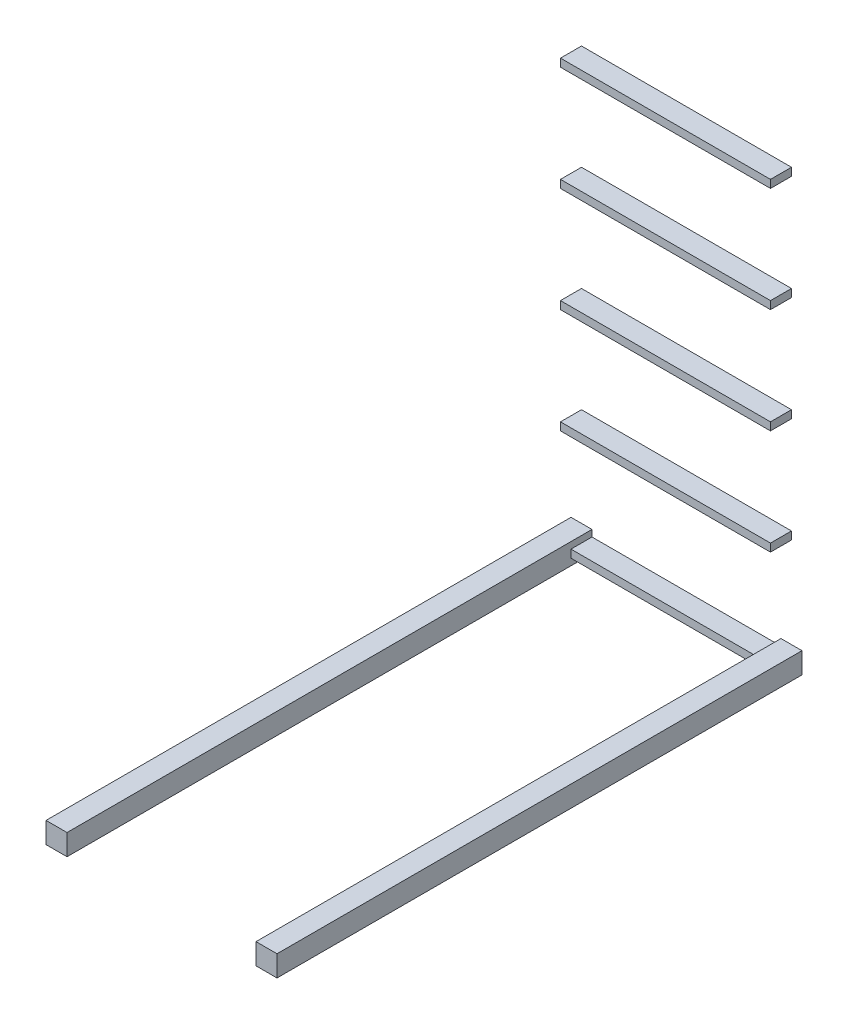
ISO-10303-21;
HEADER;
FILE_DESCRIPTION(('STEP AP214'),'2;1');
FILE_NAME('part.step','',(''),(''),'','','');
FILE_SCHEMA(('AUTOMOTIVE_DESIGN { 1 0 10303 214 1 1 1 1 }'));
ENDSEC;
DATA;
#1=APPLICATION_CONTEXT('core data for automotive mechanical design processes');
#2=APPLICATION_PROTOCOL_DEFINITION('international standard','automotive_design',2000,#1);
#3=PRODUCT_CONTEXT('',#1,'mechanical');
#4=PRODUCT('Part','Part','',(#3));
#5=PRODUCT_RELATED_PRODUCT_CATEGORY('part','',(#4));
#6=PRODUCT_DEFINITION_FORMATION('','',#4);
#7=PRODUCT_DEFINITION_CONTEXT('part definition',#1,'design');
#8=PRODUCT_DEFINITION('design','',#6,#7);
#9=PRODUCT_DEFINITION_SHAPE('','',#8);
#10=(LENGTH_UNIT() NAMED_UNIT(*) SI_UNIT(.MILLI.,.METRE.));
#11=(NAMED_UNIT(*) PLANE_ANGLE_UNIT() SI_UNIT($,.RADIAN.));
#12=(NAMED_UNIT(*) SI_UNIT($,.STERADIAN.) SOLID_ANGLE_UNIT());
#13=UNCERTAINTY_MEASURE_WITH_UNIT(LENGTH_MEASURE(1.E-05),#10,'distance_accuracy_value','');
#14=(GEOMETRIC_REPRESENTATION_CONTEXT(3) GLOBAL_UNCERTAINTY_ASSIGNED_CONTEXT((#13)) GLOBAL_UNIT_ASSIGNED_CONTEXT((#10,
#11,#12)) REPRESENTATION_CONTEXT('',''));
#15=CARTESIAN_POINT('',(0.,0.,0.));
#16=DIRECTION('',(0.,0.,1.));
#17=DIRECTION('',(1.,0.,0.));
#18=AXIS2_PLACEMENT_3D('',#15,#16,#17);
#19=CARTESIAN_POINT('',(400.,1585.,80.));
#20=DIRECTION('',(-1.,0.,0.));
#21=DIRECTION('',(0.,0.,1.));
#22=AXIS2_PLACEMENT_3D('',#19,#20,#21);
#23=PLANE('',#22);
#24=DIRECTION('',(0.,1.,0.));
#25=VECTOR('',#24,1.);
#26=CARTESIAN_POINT('',(400.,1585.,0.));
#27=LINE('',#26,#25);
#28=CARTESIAN_POINT('',(400.,1585.,0.));
#29=VERTEX_POINT('',#28);
#30=CARTESIAN_POINT('',(400.,1615.,0.));
#31=VERTEX_POINT('',#30);
#32=EDGE_CURVE('E115',#29,#31,#27,.T.);
#33=ORIENTED_EDGE('',*,*,#32,.T.);
#34=DIRECTION('',(0.,0.,-1.));
#35=VECTOR('',#34,1.);
#36=CARTESIAN_POINT('',(400.,1615.,80.));
#37=LINE('',#36,#35);
#38=CARTESIAN_POINT('',(400.,1615.,80.));
#39=VERTEX_POINT('',#38);
#40=EDGE_CURVE('E12',#39,#31,#37,.T.);
#41=ORIENTED_EDGE('',*,*,#40,.F.);
#42=DIRECTION('',(0.,1.,0.));
#43=VECTOR('',#42,1.);
#44=CARTESIAN_POINT('',(400.,1585.,80.));
#45=LINE('',#44,#43);
#46=CARTESIAN_POINT('',(400.,1585.,80.));
#47=VERTEX_POINT('',#46);
#48=EDGE_CURVE('E103',#47,#39,#45,.T.);
#49=ORIENTED_EDGE('',*,*,#48,.F.);
#50=DIRECTION('',(0.,0.,-1.));
#51=VECTOR('',#50,1.);
#52=CARTESIAN_POINT('',(400.,1585.,80.));
#53=LINE('',#52,#51);
#54=EDGE_CURVE('E111',#47,#29,#53,.T.);
#55=ORIENTED_EDGE('',*,*,#54,.T.);
#56=EDGE_LOOP('',(#33,#41,#49,#55));
#57=FACE_BOUND('',#56,.T.);
#58=ADVANCED_FACE('F52',(#57),#23,.F.);
#59=CARTESIAN_POINT('',(-400.,1615.,80.));
#60=DIRECTION('',(0.,-1.,0.));
#61=DIRECTION('',(0.,0.,-1.));
#62=AXIS2_PLACEMENT_3D('',#59,#60,#61);
#63=PLANE('',#62);
#64=DIRECTION('',(-1.,0.,0.));
#65=VECTOR('',#64,1.);
#66=CARTESIAN_POINT('',(-400.,1615.,0.));
#67=LINE('',#66,#65);
#68=CARTESIAN_POINT('',(-400.,1615.,0.));
#69=VERTEX_POINT('',#68);
#70=EDGE_CURVE('E107',#31,#69,#67,.T.);
#71=ORIENTED_EDGE('',*,*,#70,.T.);
#72=DIRECTION('',(0.,0.,-1.));
#73=VECTOR('',#72,1.);
#74=CARTESIAN_POINT('',(-400.,1615.,80.));
#75=LINE('',#74,#73);
#76=CARTESIAN_POINT('',(-400.,1615.,80.));
#77=VERTEX_POINT('',#76);
#78=EDGE_CURVE('E60',#77,#69,#75,.T.);
#79=ORIENTED_EDGE('',*,*,#78,.F.);
#80=DIRECTION('',(-1.,0.,0.));
#81=VECTOR('',#80,1.);
#82=CARTESIAN_POINT('',(-400.,1615.,80.));
#83=LINE('',#82,#81);
#84=EDGE_CURVE('E98',#39,#77,#83,.T.);
#85=ORIENTED_EDGE('',*,*,#84,.F.);
#86=ORIENTED_EDGE('',*,*,#40,.T.);
#87=EDGE_LOOP('',(#71,#79,#85,#86));
#88=FACE_BOUND('',#87,.T.);
#89=ADVANCED_FACE('F106',(#88),#63,.F.);
#90=CARTESIAN_POINT('',(-400.,1585.,80.));
#91=DIRECTION('',(1.,0.,0.));
#92=DIRECTION('',(0.,0.,-1.));
#93=AXIS2_PLACEMENT_3D('',#90,#91,#92);
#94=PLANE('',#93);
#95=DIRECTION('',(0.,-1.,0.));
#96=VECTOR('',#95,1.);
#97=CARTESIAN_POINT('',(-400.,1585.,0.));
#98=LINE('',#97,#96);
#99=CARTESIAN_POINT('',(-400.,1585.,0.));
#100=VERTEX_POINT('',#99);
#101=EDGE_CURVE('E85',#69,#100,#98,.T.);
#102=ORIENTED_EDGE('',*,*,#101,.T.);
#103=DIRECTION('',(0.,0.,-1.));
#104=VECTOR('',#103,1.);
#105=CARTESIAN_POINT('',(-400.,1585.,80.));
#106=LINE('',#105,#104);
#107=CARTESIAN_POINT('',(-400.,1585.,80.));
#108=VERTEX_POINT('',#107);
#109=EDGE_CURVE('E108',#108,#100,#106,.T.);
#110=ORIENTED_EDGE('',*,*,#109,.F.);
#111=DIRECTION('',(0.,-1.,0.));
#112=VECTOR('',#111,1.);
#113=CARTESIAN_POINT('',(-400.,1585.,80.));
#114=LINE('',#113,#112);
#115=EDGE_CURVE('E101',#77,#108,#114,.T.);
#116=ORIENTED_EDGE('',*,*,#115,.F.);
#117=ORIENTED_EDGE('',*,*,#78,.T.);
#118=EDGE_LOOP('',(#102,#110,#116,#117));
#119=FACE_BOUND('',#118,.T.);
#120=ADVANCED_FACE('F109',(#119),#94,.F.);
#121=CARTESIAN_POINT('',(-400.,1585.,80.));
#122=DIRECTION('',(0.,1.,0.));
#123=DIRECTION('',(0.,0.,1.));
#124=AXIS2_PLACEMENT_3D('',#121,#122,#123);
#125=PLANE('',#124);
#126=DIRECTION('',(1.,0.,0.));
#127=VECTOR('',#126,1.);
#128=CARTESIAN_POINT('',(-400.,1585.,0.));
#129=LINE('',#128,#127);
#130=EDGE_CURVE('E91',#100,#29,#129,.T.);
#131=ORIENTED_EDGE('',*,*,#130,.T.);
#132=ORIENTED_EDGE('',*,*,#54,.F.);
#133=DIRECTION('',(1.,0.,0.));
#134=VECTOR('',#133,1.);
#135=CARTESIAN_POINT('',(-400.,1585.,80.));
#136=LINE('',#135,#134);
#137=EDGE_CURVE('E68',#108,#47,#136,.T.);
#138=ORIENTED_EDGE('',*,*,#137,.F.);
#139=ORIENTED_EDGE('',*,*,#109,.T.);
#140=EDGE_LOOP('',(#131,#132,#138,#139));
#141=FACE_BOUND('',#140,.T.);
#142=ADVANCED_FACE('F122',(#141),#125,.F.);
#143=CARTESIAN_POINT('',(0.,0.,80.));
#144=DIRECTION('',(0.,0.,-1.));
#145=DIRECTION('',(-1.,0.,0.));
#146=AXIS2_PLACEMENT_3D('',#143,#144,#145);
#147=PLANE('',#146);
#148=ORIENTED_EDGE('',*,*,#48,.T.);
#149=ORIENTED_EDGE('',*,*,#84,.T.);
#150=ORIENTED_EDGE('',*,*,#115,.T.);
#151=ORIENTED_EDGE('',*,*,#137,.T.);
#152=EDGE_LOOP('',(#148,#149,#150,#151));
#153=FACE_BOUND('',#152,.T.);
#154=ADVANCED_FACE('F99',(#153),#147,.F.);
#155=CARTESIAN_POINT('',(0.,0.,0.));
#156=DIRECTION('',(0.,0.,-1.));
#157=DIRECTION('',(-1.,0.,0.));
#158=AXIS2_PLACEMENT_3D('',#155,#156,#157);
#159=PLANE('',#158);
#160=ORIENTED_EDGE('',*,*,#32,.F.);
#161=ORIENTED_EDGE('',*,*,#130,.F.);
#162=ORIENTED_EDGE('',*,*,#101,.F.);
#163=ORIENTED_EDGE('',*,*,#70,.F.);
#164=EDGE_LOOP('',(#160,#161,#162,#163));
#165=FACE_BOUND('',#164,.T.);
#166=ADVANCED_FACE('F125',(#165),#159,.T.);
#167=CLOSED_SHELL('',(#58,#89,#120,#142,#154,#166));
#168=MANIFOLD_SOLID_BREP('B2',#167);
#169=CARTESIAN_POINT('',(400.,1185.,80.));
#170=DIRECTION('',(-1.,0.,0.));
#171=DIRECTION('',(0.,0.,1.));
#172=AXIS2_PLACEMENT_3D('',#169,#170,#171);
#173=PLANE('',#172);
#174=DIRECTION('',(0.,1.,0.));
#175=VECTOR('',#174,1.);
#176=CARTESIAN_POINT('',(400.,1185.,0.));
#177=LINE('',#176,#175);
#178=CARTESIAN_POINT('',(400.,1185.,0.));
#179=VERTEX_POINT('',#178);
#180=CARTESIAN_POINT('',(400.,1215.,0.));
#181=VERTEX_POINT('',#180);
#182=EDGE_CURVE('E249',#179,#181,#177,.T.);
#183=ORIENTED_EDGE('',*,*,#182,.T.);
#184=DIRECTION('',(0.,0.,-1.));
#185=VECTOR('',#184,1.);
#186=CARTESIAN_POINT('',(400.,1215.,80.));
#187=LINE('',#186,#185);
#188=CARTESIAN_POINT('',(400.,1215.,80.));
#189=VERTEX_POINT('',#188);
#190=EDGE_CURVE('E50',#189,#181,#187,.T.);
#191=ORIENTED_EDGE('',*,*,#190,.F.);
#192=DIRECTION('',(0.,1.,0.));
#193=VECTOR('',#192,1.);
#194=CARTESIAN_POINT('',(400.,1185.,80.));
#195=LINE('',#194,#193);
#196=CARTESIAN_POINT('',(400.,1185.,80.));
#197=VERTEX_POINT('',#196);
#198=EDGE_CURVE('E237',#197,#189,#195,.T.);
#199=ORIENTED_EDGE('',*,*,#198,.F.);
#200=DIRECTION('',(0.,0.,-1.));
#201=VECTOR('',#200,1.);
#202=CARTESIAN_POINT('',(400.,1185.,80.));
#203=LINE('',#202,#201);
#204=EDGE_CURVE('E245',#197,#179,#203,.T.);
#205=ORIENTED_EDGE('',*,*,#204,.T.);
#206=EDGE_LOOP('',(#183,#191,#199,#205));
#207=FACE_BOUND('',#206,.T.);
#208=ADVANCED_FACE('F186',(#207),#173,.F.);
#209=CARTESIAN_POINT('',(-400.,1215.,80.));
#210=DIRECTION('',(0.,-1.,0.));
#211=DIRECTION('',(0.,0.,-1.));
#212=AXIS2_PLACEMENT_3D('',#209,#210,#211);
#213=PLANE('',#212);
#214=DIRECTION('',(-1.,0.,0.));
#215=VECTOR('',#214,1.);
#216=CARTESIAN_POINT('',(-400.,1215.,0.));
#217=LINE('',#216,#215);
#218=CARTESIAN_POINT('',(-400.,1215.,0.));
#219=VERTEX_POINT('',#218);
#220=EDGE_CURVE('E241',#181,#219,#217,.T.);
#221=ORIENTED_EDGE('',*,*,#220,.T.);
#222=DIRECTION('',(0.,0.,-1.));
#223=VECTOR('',#222,1.);
#224=CARTESIAN_POINT('',(-400.,1215.,80.));
#225=LINE('',#224,#223);
#226=CARTESIAN_POINT('',(-400.,1215.,80.));
#227=VERTEX_POINT('',#226);
#228=EDGE_CURVE('E194',#227,#219,#225,.T.);
#229=ORIENTED_EDGE('',*,*,#228,.F.);
#230=DIRECTION('',(-1.,0.,0.));
#231=VECTOR('',#230,1.);
#232=CARTESIAN_POINT('',(-400.,1215.,80.));
#233=LINE('',#232,#231);
#234=EDGE_CURVE('E232',#189,#227,#233,.T.);
#235=ORIENTED_EDGE('',*,*,#234,.F.);
#236=ORIENTED_EDGE('',*,*,#190,.T.);
#237=EDGE_LOOP('',(#221,#229,#235,#236));
#238=FACE_BOUND('',#237,.T.);
#239=ADVANCED_FACE('F240',(#238),#213,.F.);
#240=CARTESIAN_POINT('',(-400.,1185.,80.));
#241=DIRECTION('',(1.,0.,0.));
#242=DIRECTION('',(0.,0.,-1.));
#243=AXIS2_PLACEMENT_3D('',#240,#241,#242);
#244=PLANE('',#243);
#245=DIRECTION('',(0.,-1.,0.));
#246=VECTOR('',#245,1.);
#247=CARTESIAN_POINT('',(-400.,1185.,0.));
#248=LINE('',#247,#246);
#249=CARTESIAN_POINT('',(-400.,1185.,0.));
#250=VERTEX_POINT('',#249);
#251=EDGE_CURVE('E219',#219,#250,#248,.T.);
#252=ORIENTED_EDGE('',*,*,#251,.T.);
#253=DIRECTION('',(0.,0.,-1.));
#254=VECTOR('',#253,1.);
#255=CARTESIAN_POINT('',(-400.,1185.,80.));
#256=LINE('',#255,#254);
#257=CARTESIAN_POINT('',(-400.,1185.,80.));
#258=VERTEX_POINT('',#257);
#259=EDGE_CURVE('E242',#258,#250,#256,.T.);
#260=ORIENTED_EDGE('',*,*,#259,.F.);
#261=DIRECTION('',(0.,-1.,0.));
#262=VECTOR('',#261,1.);
#263=CARTESIAN_POINT('',(-400.,1185.,80.));
#264=LINE('',#263,#262);
#265=EDGE_CURVE('E235',#227,#258,#264,.T.);
#266=ORIENTED_EDGE('',*,*,#265,.F.);
#267=ORIENTED_EDGE('',*,*,#228,.T.);
#268=EDGE_LOOP('',(#252,#260,#266,#267));
#269=FACE_BOUND('',#268,.T.);
#270=ADVANCED_FACE('F243',(#269),#244,.F.);
#271=CARTESIAN_POINT('',(-400.,1185.,80.));
#272=DIRECTION('',(0.,1.,0.));
#273=DIRECTION('',(0.,0.,1.));
#274=AXIS2_PLACEMENT_3D('',#271,#272,#273);
#275=PLANE('',#274);
#276=DIRECTION('',(1.,0.,0.));
#277=VECTOR('',#276,1.);
#278=CARTESIAN_POINT('',(-400.,1185.,0.));
#279=LINE('',#278,#277);
#280=EDGE_CURVE('E225',#250,#179,#279,.T.);
#281=ORIENTED_EDGE('',*,*,#280,.T.);
#282=ORIENTED_EDGE('',*,*,#204,.F.);
#283=DIRECTION('',(1.,0.,0.));
#284=VECTOR('',#283,1.);
#285=CARTESIAN_POINT('',(-400.,1185.,80.));
#286=LINE('',#285,#284);
#287=EDGE_CURVE('E202',#258,#197,#286,.T.);
#288=ORIENTED_EDGE('',*,*,#287,.F.);
#289=ORIENTED_EDGE('',*,*,#259,.T.);
#290=EDGE_LOOP('',(#281,#282,#288,#289));
#291=FACE_BOUND('',#290,.T.);
#292=ADVANCED_FACE('F256',(#291),#275,.F.);
#293=CARTESIAN_POINT('',(0.,0.,80.));
#294=DIRECTION('',(0.,0.,-1.));
#295=DIRECTION('',(-1.,0.,0.));
#296=AXIS2_PLACEMENT_3D('',#293,#294,#295);
#297=PLANE('',#296);
#298=ORIENTED_EDGE('',*,*,#198,.T.);
#299=ORIENTED_EDGE('',*,*,#234,.T.);
#300=ORIENTED_EDGE('',*,*,#265,.T.);
#301=ORIENTED_EDGE('',*,*,#287,.T.);
#302=EDGE_LOOP('',(#298,#299,#300,#301));
#303=FACE_BOUND('',#302,.T.);
#304=ADVANCED_FACE('F233',(#303),#297,.F.);
#305=CARTESIAN_POINT('',(0.,0.,0.));
#306=DIRECTION('',(0.,0.,-1.));
#307=DIRECTION('',(-1.,0.,0.));
#308=AXIS2_PLACEMENT_3D('',#305,#306,#307);
#309=PLANE('',#308);
#310=ORIENTED_EDGE('',*,*,#182,.F.);
#311=ORIENTED_EDGE('',*,*,#280,.F.);
#312=ORIENTED_EDGE('',*,*,#251,.F.);
#313=ORIENTED_EDGE('',*,*,#220,.F.);
#314=EDGE_LOOP('',(#310,#311,#312,#313));
#315=FACE_BOUND('',#314,.T.);
#316=ADVANCED_FACE('F259',(#315),#309,.T.);
#317=CLOSED_SHELL('',(#208,#239,#270,#292,#304,#316));
#318=MANIFOLD_SOLID_BREP('B6',#317);
#319=CARTESIAN_POINT('',(400.,785.,80.));
#320=DIRECTION('',(-1.,0.,0.));
#321=DIRECTION('',(0.,0.,1.));
#322=AXIS2_PLACEMENT_3D('',#319,#320,#321);
#323=PLANE('',#322);
#324=DIRECTION('',(0.,1.,0.));
#325=VECTOR('',#324,1.);
#326=CARTESIAN_POINT('',(400.,785.,0.));
#327=LINE('',#326,#325);
#328=CARTESIAN_POINT('',(400.,785.,0.));
#329=VERTEX_POINT('',#328);
#330=CARTESIAN_POINT('',(400.,815.,0.));
#331=VERTEX_POINT('',#330);
#332=EDGE_CURVE('E383',#329,#331,#327,.T.);
#333=ORIENTED_EDGE('',*,*,#332,.T.);
#334=DIRECTION('',(0.,0.,-1.));
#335=VECTOR('',#334,1.);
#336=CARTESIAN_POINT('',(400.,815.,80.));
#337=LINE('',#336,#335);
#338=CARTESIAN_POINT('',(400.,815.,80.));
#339=VERTEX_POINT('',#338);
#340=EDGE_CURVE('E184',#339,#331,#337,.T.);
#341=ORIENTED_EDGE('',*,*,#340,.F.);
#342=DIRECTION('',(0.,1.,0.));
#343=VECTOR('',#342,1.);
#344=CARTESIAN_POINT('',(400.,785.,80.));
#345=LINE('',#344,#343);
#346=CARTESIAN_POINT('',(400.,785.,80.));
#347=VERTEX_POINT('',#346);
#348=EDGE_CURVE('E371',#347,#339,#345,.T.);
#349=ORIENTED_EDGE('',*,*,#348,.F.);
#350=DIRECTION('',(0.,0.,-1.));
#351=VECTOR('',#350,1.);
#352=CARTESIAN_POINT('',(400.,785.,80.));
#353=LINE('',#352,#351);
#354=EDGE_CURVE('E379',#347,#329,#353,.T.);
#355=ORIENTED_EDGE('',*,*,#354,.T.);
#356=EDGE_LOOP('',(#333,#341,#349,#355));
#357=FACE_BOUND('',#356,.T.);
#358=ADVANCED_FACE('F320',(#357),#323,.F.);
#359=CARTESIAN_POINT('',(-400.,815.,80.));
#360=DIRECTION('',(0.,-1.,0.));
#361=DIRECTION('',(0.,0.,-1.));
#362=AXIS2_PLACEMENT_3D('',#359,#360,#361);
#363=PLANE('',#362);
#364=DIRECTION('',(-1.,0.,0.));
#365=VECTOR('',#364,1.);
#366=CARTESIAN_POINT('',(-400.,815.,0.));
#367=LINE('',#366,#365);
#368=CARTESIAN_POINT('',(-400.,815.,0.));
#369=VERTEX_POINT('',#368);
#370=EDGE_CURVE('E375',#331,#369,#367,.T.);
#371=ORIENTED_EDGE('',*,*,#370,.T.);
#372=DIRECTION('',(0.,0.,-1.));
#373=VECTOR('',#372,1.);
#374=CARTESIAN_POINT('',(-400.,815.,80.));
#375=LINE('',#374,#373);
#376=CARTESIAN_POINT('',(-400.,815.,80.));
#377=VERTEX_POINT('',#376);
#378=EDGE_CURVE('E328',#377,#369,#375,.T.);
#379=ORIENTED_EDGE('',*,*,#378,.F.);
#380=DIRECTION('',(-1.,0.,0.));
#381=VECTOR('',#380,1.);
#382=CARTESIAN_POINT('',(-400.,815.,80.));
#383=LINE('',#382,#381);
#384=EDGE_CURVE('E366',#339,#377,#383,.T.);
#385=ORIENTED_EDGE('',*,*,#384,.F.);
#386=ORIENTED_EDGE('',*,*,#340,.T.);
#387=EDGE_LOOP('',(#371,#379,#385,#386));
#388=FACE_BOUND('',#387,.T.);
#389=ADVANCED_FACE('F374',(#388),#363,.F.);
#390=CARTESIAN_POINT('',(-400.,785.,80.));
#391=DIRECTION('',(1.,0.,0.));
#392=DIRECTION('',(0.,0.,-1.));
#393=AXIS2_PLACEMENT_3D('',#390,#391,#392);
#394=PLANE('',#393);
#395=DIRECTION('',(0.,-1.,0.));
#396=VECTOR('',#395,1.);
#397=CARTESIAN_POINT('',(-400.,785.,0.));
#398=LINE('',#397,#396);
#399=CARTESIAN_POINT('',(-400.,785.,0.));
#400=VERTEX_POINT('',#399);
#401=EDGE_CURVE('E353',#369,#400,#398,.T.);
#402=ORIENTED_EDGE('',*,*,#401,.T.);
#403=DIRECTION('',(0.,0.,-1.));
#404=VECTOR('',#403,1.);
#405=CARTESIAN_POINT('',(-400.,785.,80.));
#406=LINE('',#405,#404);
#407=CARTESIAN_POINT('',(-400.,785.,80.));
#408=VERTEX_POINT('',#407);
#409=EDGE_CURVE('E376',#408,#400,#406,.T.);
#410=ORIENTED_EDGE('',*,*,#409,.F.);
#411=DIRECTION('',(0.,-1.,0.));
#412=VECTOR('',#411,1.);
#413=CARTESIAN_POINT('',(-400.,785.,80.));
#414=LINE('',#413,#412);
#415=EDGE_CURVE('E369',#377,#408,#414,.T.);
#416=ORIENTED_EDGE('',*,*,#415,.F.);
#417=ORIENTED_EDGE('',*,*,#378,.T.);
#418=EDGE_LOOP('',(#402,#410,#416,#417));
#419=FACE_BOUND('',#418,.T.);
#420=ADVANCED_FACE('F377',(#419),#394,.F.);
#421=CARTESIAN_POINT('',(-400.,785.,80.));
#422=DIRECTION('',(0.,1.,0.));
#423=DIRECTION('',(0.,0.,1.));
#424=AXIS2_PLACEMENT_3D('',#421,#422,#423);
#425=PLANE('',#424);
#426=DIRECTION('',(1.,0.,0.));
#427=VECTOR('',#426,1.);
#428=CARTESIAN_POINT('',(-400.,785.,0.));
#429=LINE('',#428,#427);
#430=EDGE_CURVE('E359',#400,#329,#429,.T.);
#431=ORIENTED_EDGE('',*,*,#430,.T.);
#432=ORIENTED_EDGE('',*,*,#354,.F.);
#433=DIRECTION('',(1.,0.,0.));
#434=VECTOR('',#433,1.);
#435=CARTESIAN_POINT('',(-400.,785.,80.));
#436=LINE('',#435,#434);
#437=EDGE_CURVE('E336',#408,#347,#436,.T.);
#438=ORIENTED_EDGE('',*,*,#437,.F.);
#439=ORIENTED_EDGE('',*,*,#409,.T.);
#440=EDGE_LOOP('',(#431,#432,#438,#439));
#441=FACE_BOUND('',#440,.T.);
#442=ADVANCED_FACE('F390',(#441),#425,.F.);
#443=CARTESIAN_POINT('',(0.,0.,80.));
#444=DIRECTION('',(0.,0.,-1.));
#445=DIRECTION('',(-1.,0.,0.));
#446=AXIS2_PLACEMENT_3D('',#443,#444,#445);
#447=PLANE('',#446);
#448=ORIENTED_EDGE('',*,*,#348,.T.);
#449=ORIENTED_EDGE('',*,*,#384,.T.);
#450=ORIENTED_EDGE('',*,*,#415,.T.);
#451=ORIENTED_EDGE('',*,*,#437,.T.);
#452=EDGE_LOOP('',(#448,#449,#450,#451));
#453=FACE_BOUND('',#452,.T.);
#454=ADVANCED_FACE('F367',(#453),#447,.F.);
#455=CARTESIAN_POINT('',(0.,0.,0.));
#456=DIRECTION('',(0.,0.,-1.));
#457=DIRECTION('',(-1.,0.,0.));
#458=AXIS2_PLACEMENT_3D('',#455,#456,#457);
#459=PLANE('',#458);
#460=ORIENTED_EDGE('',*,*,#332,.F.);
#461=ORIENTED_EDGE('',*,*,#430,.F.);
#462=ORIENTED_EDGE('',*,*,#401,.F.);
#463=ORIENTED_EDGE('',*,*,#370,.F.);
#464=EDGE_LOOP('',(#460,#461,#462,#463));
#465=FACE_BOUND('',#464,.T.);
#466=ADVANCED_FACE('F393',(#465),#459,.T.);
#467=CLOSED_SHELL('',(#358,#389,#420,#442,#454,#466));
#468=MANIFOLD_SOLID_BREP('B44',#467);
#469=CARTESIAN_POINT('',(400.,385.,80.));
#470=DIRECTION('',(-1.,0.,0.));
#471=DIRECTION('',(0.,0.,1.));
#472=AXIS2_PLACEMENT_3D('',#469,#470,#471);
#473=PLANE('',#472);
#474=DIRECTION('',(0.,1.,0.));
#475=VECTOR('',#474,1.);
#476=CARTESIAN_POINT('',(400.,385.,0.));
#477=LINE('',#476,#475);
#478=CARTESIAN_POINT('',(400.,385.,0.));
#479=VERTEX_POINT('',#478);
#480=CARTESIAN_POINT('',(400.,415.,0.));
#481=VERTEX_POINT('',#480);
#482=EDGE_CURVE('E516',#479,#481,#477,.T.);
#483=ORIENTED_EDGE('',*,*,#482,.T.);
#484=DIRECTION('',(0.,0.,-1.));
#485=VECTOR('',#484,1.);
#486=CARTESIAN_POINT('',(400.,415.,80.));
#487=LINE('',#486,#485);
#488=CARTESIAN_POINT('',(400.,415.,80.));
#489=VERTEX_POINT('',#488);
#490=EDGE_CURVE('E318',#489,#481,#487,.T.);
#491=ORIENTED_EDGE('',*,*,#490,.F.);
#492=DIRECTION('',(0.,1.,0.));
#493=VECTOR('',#492,1.);
#494=CARTESIAN_POINT('',(400.,385.,80.));
#495=LINE('',#494,#493);
#496=CARTESIAN_POINT('',(400.,385.,80.));
#497=VERTEX_POINT('',#496);
#498=EDGE_CURVE('E504',#497,#489,#495,.T.);
#499=ORIENTED_EDGE('',*,*,#498,.F.);
#500=DIRECTION('',(0.,0.,-1.));
#501=VECTOR('',#500,1.);
#502=CARTESIAN_POINT('',(400.,385.,80.));
#503=LINE('',#502,#501);
#504=EDGE_CURVE('E512',#497,#479,#503,.T.);
#505=ORIENTED_EDGE('',*,*,#504,.T.);
#506=EDGE_LOOP('',(#483,#491,#499,#505));
#507=FACE_BOUND('',#506,.T.);
#508=ADVANCED_FACE('F453',(#507),#473,.F.);
#509=CARTESIAN_POINT('',(-400.,415.,80.));
#510=DIRECTION('',(0.,-1.,0.));
#511=DIRECTION('',(0.,0.,-1.));
#512=AXIS2_PLACEMENT_3D('',#509,#510,#511);
#513=PLANE('',#512);
#514=DIRECTION('',(-1.,0.,0.));
#515=VECTOR('',#514,1.);
#516=CARTESIAN_POINT('',(-400.,415.,0.));
#517=LINE('',#516,#515);
#518=CARTESIAN_POINT('',(-400.,415.,0.));
#519=VERTEX_POINT('',#518);
#520=EDGE_CURVE('E508',#481,#519,#517,.T.);
#521=ORIENTED_EDGE('',*,*,#520,.T.);
#522=DIRECTION('',(0.,0.,-1.));
#523=VECTOR('',#522,1.);
#524=CARTESIAN_POINT('',(-400.,415.,80.));
#525=LINE('',#524,#523);
#526=CARTESIAN_POINT('',(-400.,415.,80.));
#527=VERTEX_POINT('',#526);
#528=EDGE_CURVE('E461',#527,#519,#525,.T.);
#529=ORIENTED_EDGE('',*,*,#528,.F.);
#530=DIRECTION('',(-1.,0.,0.));
#531=VECTOR('',#530,1.);
#532=CARTESIAN_POINT('',(-400.,415.,80.));
#533=LINE('',#532,#531);
#534=EDGE_CURVE('E499',#489,#527,#533,.T.);
#535=ORIENTED_EDGE('',*,*,#534,.F.);
#536=ORIENTED_EDGE('',*,*,#490,.T.);
#537=EDGE_LOOP('',(#521,#529,#535,#536));
#538=FACE_BOUND('',#537,.T.);
#539=ADVANCED_FACE('F507',(#538),#513,.F.);
#540=CARTESIAN_POINT('',(-400.,385.,80.));
#541=DIRECTION('',(1.,0.,0.));
#542=DIRECTION('',(0.,0.,-1.));
#543=AXIS2_PLACEMENT_3D('',#540,#541,#542);
#544=PLANE('',#543);
#545=DIRECTION('',(0.,-1.,0.));
#546=VECTOR('',#545,1.);
#547=CARTESIAN_POINT('',(-400.,385.,0.));
#548=LINE('',#547,#546);
#549=CARTESIAN_POINT('',(-400.,385.,0.));
#550=VERTEX_POINT('',#549);
#551=EDGE_CURVE('E486',#519,#550,#548,.T.);
#552=ORIENTED_EDGE('',*,*,#551,.T.);
#553=DIRECTION('',(0.,0.,-1.));
#554=VECTOR('',#553,1.);
#555=CARTESIAN_POINT('',(-400.,385.,80.));
#556=LINE('',#555,#554);
#557=CARTESIAN_POINT('',(-400.,385.,80.));
#558=VERTEX_POINT('',#557);
#559=EDGE_CURVE('E509',#558,#550,#556,.T.);
#560=ORIENTED_EDGE('',*,*,#559,.F.);
#561=DIRECTION('',(0.,-1.,0.));
#562=VECTOR('',#561,1.);
#563=CARTESIAN_POINT('',(-400.,385.,80.));
#564=LINE('',#563,#562);
#565=EDGE_CURVE('E502',#527,#558,#564,.T.);
#566=ORIENTED_EDGE('',*,*,#565,.F.);
#567=ORIENTED_EDGE('',*,*,#528,.T.);
#568=EDGE_LOOP('',(#552,#560,#566,#567));
#569=FACE_BOUND('',#568,.T.);
#570=ADVANCED_FACE('F510',(#569),#544,.F.);
#571=CARTESIAN_POINT('',(-400.,385.,80.));
#572=DIRECTION('',(0.,1.,0.));
#573=DIRECTION('',(0.,0.,1.));
#574=AXIS2_PLACEMENT_3D('',#571,#572,#573);
#575=PLANE('',#574);
#576=DIRECTION('',(1.,0.,0.));
#577=VECTOR('',#576,1.);
#578=CARTESIAN_POINT('',(-400.,385.,0.));
#579=LINE('',#578,#577);
#580=EDGE_CURVE('E492',#550,#479,#579,.T.);
#581=ORIENTED_EDGE('',*,*,#580,.T.);
#582=ORIENTED_EDGE('',*,*,#504,.F.);
#583=DIRECTION('',(1.,0.,0.));
#584=VECTOR('',#583,1.);
#585=CARTESIAN_POINT('',(-400.,385.,80.));
#586=LINE('',#585,#584);
#587=EDGE_CURVE('E469',#558,#497,#586,.T.);
#588=ORIENTED_EDGE('',*,*,#587,.F.);
#589=ORIENTED_EDGE('',*,*,#559,.T.);
#590=EDGE_LOOP('',(#581,#582,#588,#589));
#591=FACE_BOUND('',#590,.T.);
#592=ADVANCED_FACE('F523',(#591),#575,.F.);
#593=CARTESIAN_POINT('',(0.,0.,80.));
#594=DIRECTION('',(0.,0.,-1.));
#595=DIRECTION('',(-1.,0.,0.));
#596=AXIS2_PLACEMENT_3D('',#593,#594,#595);
#597=PLANE('',#596);
#598=ORIENTED_EDGE('',*,*,#498,.T.);
#599=ORIENTED_EDGE('',*,*,#534,.T.);
#600=ORIENTED_EDGE('',*,*,#565,.T.);
#601=ORIENTED_EDGE('',*,*,#587,.T.);
#602=EDGE_LOOP('',(#598,#599,#600,#601));
#603=FACE_BOUND('',#602,.T.);
#604=ADVANCED_FACE('F500',(#603),#597,.F.);
#605=CARTESIAN_POINT('',(0.,0.,0.));
#606=DIRECTION('',(0.,0.,-1.));
#607=DIRECTION('',(-1.,0.,0.));
#608=AXIS2_PLACEMENT_3D('',#605,#606,#607);
#609=PLANE('',#608);
#610=ORIENTED_EDGE('',*,*,#482,.F.);
#611=ORIENTED_EDGE('',*,*,#580,.F.);
#612=ORIENTED_EDGE('',*,*,#551,.F.);
#613=ORIENTED_EDGE('',*,*,#520,.F.);
#614=EDGE_LOOP('',(#610,#611,#612,#613));
#615=FACE_BOUND('',#614,.T.);
#616=ADVANCED_FACE('F526',(#615),#609,.T.);
#617=CLOSED_SHELL('',(#508,#539,#570,#592,#604,#616));
#618=MANIFOLD_SOLID_BREP('B178',#617);
#619=CARTESIAN_POINT('',(0.,0.,80.));
#620=DIRECTION('',(0.,0.,-1.));
#621=DIRECTION('',(-1.,0.,0.));
#622=AXIS2_PLACEMENT_3D('',#619,#620,#621);
#623=PLANE('',#622);
#624=DIRECTION('',(0.,-1.,0.));
#625=VECTOR('',#624,1.);
#626=CARTESIAN_POINT('',(360.,0.,80.));
#627=LINE('',#626,#625);
#628=CARTESIAN_POINT('',(360.,15.,80.));
#629=VERTEX_POINT('',#628);
#630=CARTESIAN_POINT('',(360.,-15.,80.));
#631=VERTEX_POINT('',#630);
#632=EDGE_CURVE('E592',#629,#631,#627,.T.);
#633=ORIENTED_EDGE('',*,*,#632,.F.);
#634=DIRECTION('',(-1.,0.,0.));
#635=VECTOR('',#634,1.);
#636=CARTESIAN_POINT('',(-400.,15.,80.));
#637=LINE('',#636,#635);
#638=CARTESIAN_POINT('',(-360.,15.,80.0000000000001));
#639=VERTEX_POINT('',#638);
#640=EDGE_CURVE('E700',#629,#639,#637,.T.);
#641=ORIENTED_EDGE('',*,*,#640,.T.);
#642=DIRECTION('',(0.,-1.,0.));
#643=VECTOR('',#642,1.);
#644=CARTESIAN_POINT('',(-360.,-40.,80.0000000000001));
#645=LINE('',#644,#643);
#646=CARTESIAN_POINT('',(-360.,-15.,80.0000000000001));
#647=VERTEX_POINT('',#646);
#648=EDGE_CURVE('E585',#639,#647,#645,.T.);
#649=ORIENTED_EDGE('',*,*,#648,.T.);
#650=DIRECTION('',(1.,0.,0.));
#651=VECTOR('',#650,1.);
#652=CARTESIAN_POINT('',(-400.,-15.,80.));
#653=LINE('',#652,#651);
#654=EDGE_CURVE('E702',#647,#631,#653,.T.);
#655=ORIENTED_EDGE('',*,*,#654,.T.);
#656=EDGE_LOOP('',(#633,#641,#649,#655));
#657=FACE_BOUND('',#656,.T.);
#658=ADVANCED_FACE('F577',(#657),#623,.F.);
#659=CARTESIAN_POINT('',(-400.,15.,80.));
#660=DIRECTION('',(0.,-1.,0.));
#661=DIRECTION('',(0.,0.,-1.));
#662=AXIS2_PLACEMENT_3D('',#659,#660,#661);
#663=PLANE('',#662);
#664=DIRECTION('',(0.,0.,1.));
#665=VECTOR('',#664,1.);
#666=CARTESIAN_POINT('',(360.,15.,80.));
#667=LINE('',#666,#665);
#668=CARTESIAN_POINT('',(360.,15.,0.));
#669=VERTEX_POINT('',#668);
#670=EDGE_CURVE('E599',#669,#629,#667,.T.);
#671=ORIENTED_EDGE('',*,*,#670,.F.);
#672=DIRECTION('',(-1.,0.,0.));
#673=VECTOR('',#672,1.);
#674=CARTESIAN_POINT('',(-400.,15.,0.));
#675=LINE('',#674,#673);
#676=CARTESIAN_POINT('',(-360.,15.,0.));
#677=VERTEX_POINT('',#676);
#678=EDGE_CURVE('E699',#669,#677,#675,.T.);
#679=ORIENTED_EDGE('',*,*,#678,.T.);
#680=DIRECTION('',(0.,0.,1.));
#681=VECTOR('',#680,1.);
#682=CARTESIAN_POINT('',(-360.,15.,2000.));
#683=LINE('',#682,#681);
#684=EDGE_CURVE('E710',#677,#639,#683,.T.);
#685=ORIENTED_EDGE('',*,*,#684,.T.);
#686=ORIENTED_EDGE('',*,*,#640,.F.);
#687=EDGE_LOOP('',(#671,#679,#685,#686));
#688=FACE_BOUND('',#687,.T.);
#689=ADVANCED_FACE('F776',(#688),#663,.F.);
#690=CARTESIAN_POINT('',(-400.,-15.,80.));
#691=DIRECTION('',(0.,1.,0.));
#692=DIRECTION('',(0.,0.,1.));
#693=AXIS2_PLACEMENT_3D('',#690,#691,#692);
#694=PLANE('',#693);
#695=DIRECTION('',(0.,0.,-1.));
#696=VECTOR('',#695,1.);
#697=CARTESIAN_POINT('',(360.,-15.,80.));
#698=LINE('',#697,#696);
#699=CARTESIAN_POINT('',(360.,-15.,0.));
#700=VERTEX_POINT('',#699);
#701=EDGE_CURVE('E451',#631,#700,#698,.T.);
#702=ORIENTED_EDGE('',*,*,#701,.F.);
#703=ORIENTED_EDGE('',*,*,#654,.F.);
#704=DIRECTION('',(0.,0.,-1.));
#705=VECTOR('',#704,1.);
#706=CARTESIAN_POINT('',(-360.,-15.,2000.));
#707=LINE('',#706,#705);
#708=CARTESIAN_POINT('',(-360.,-15.,0.));
#709=VERTEX_POINT('',#708);
#710=EDGE_CURVE('E705',#647,#709,#707,.T.);
#711=ORIENTED_EDGE('',*,*,#710,.T.);
#712=DIRECTION('',(1.,0.,0.));
#713=VECTOR('',#712,1.);
#714=CARTESIAN_POINT('',(-400.,-15.,0.));
#715=LINE('',#714,#713);
#716=EDGE_CURVE('E703',#709,#700,#715,.T.);
#717=ORIENTED_EDGE('',*,*,#716,.T.);
#718=EDGE_LOOP('',(#702,#703,#711,#717));
#719=FACE_BOUND('',#718,.T.);
#720=ADVANCED_FACE('F748',(#719),#694,.F.);
#721=CARTESIAN_POINT('',(-360.,-40.,2000.));
#722=DIRECTION('',(-1.,0.,0.));
#723=DIRECTION('',(0.,0.,1.));
#724=AXIS2_PLACEMENT_3D('',#721,#722,#723);
#725=PLANE('',#724);
#726=ORIENTED_EDGE('',*,*,#684,.F.);
#727=DIRECTION('',(0.,1.,0.));
#728=VECTOR('',#727,1.);
#729=CARTESIAN_POINT('',(-360.,-40.,0.));
#730=LINE('',#729,#728);
#731=CARTESIAN_POINT('',(-360.,40.,0.));
#732=VERTEX_POINT('',#731);
#733=EDGE_CURVE('E713',#677,#732,#730,.T.);
#734=ORIENTED_EDGE('',*,*,#733,.T.);
#735=DIRECTION('',(0.,0.,-1.));
#736=VECTOR('',#735,1.);
#737=CARTESIAN_POINT('',(-360.,40.,2000.));
#738=LINE('',#737,#736);
#739=CARTESIAN_POINT('',(-360.,40.,2000.));
#740=VERTEX_POINT('',#739);
#741=EDGE_CURVE('E740',#740,#732,#738,.T.);
#742=ORIENTED_EDGE('',*,*,#741,.F.);
#743=DIRECTION('',(0.,1.,0.));
#744=VECTOR('',#743,1.);
#745=CARTESIAN_POINT('',(-360.,-40.,2000.));
#746=LINE('',#745,#744);
#747=CARTESIAN_POINT('',(-360.,-40.,2000.));
#748=VERTEX_POINT('',#747);
#749=EDGE_CURVE('E714',#748,#740,#746,.T.);
#750=ORIENTED_EDGE('',*,*,#749,.F.);
#751=DIRECTION('',(0.,0.,-1.));
#752=VECTOR('',#751,1.);
#753=CARTESIAN_POINT('',(-360.,-40.,2000.));
#754=LINE('',#753,#752);
#755=CARTESIAN_POINT('',(-360.,-40.,0.));
#756=VERTEX_POINT('',#755);
#757=EDGE_CURVE('E724',#748,#756,#754,.T.);
#758=ORIENTED_EDGE('',*,*,#757,.T.);
#759=EDGE_CURVE('E725',#756,#709,#730,.T.);
#760=ORIENTED_EDGE('',*,*,#759,.T.);
#761=ORIENTED_EDGE('',*,*,#710,.F.);
#762=ORIENTED_EDGE('',*,*,#648,.F.);
#763=EDGE_LOOP('',(#726,#734,#742,#750,#758,#760,#761,#762));
#764=FACE_BOUND('',#763,.T.);
#765=ADVANCED_FACE('F579',(#764),#725,.F.);
#766=CARTESIAN_POINT('',(-440.,40.,2000.));
#767=DIRECTION('',(0.,-1.,0.));
#768=DIRECTION('',(0.,0.,-1.));
#769=AXIS2_PLACEMENT_3D('',#766,#767,#768);
#770=PLANE('',#769);
#771=DIRECTION('',(-1.,0.,0.));
#772=VECTOR('',#771,1.);
#773=CARTESIAN_POINT('',(-440.,40.,0.));
#774=LINE('',#773,#772);
#775=CARTESIAN_POINT('',(-440.,40.,0.));
#776=VERTEX_POINT('',#775);
#777=EDGE_CURVE('E727',#732,#776,#774,.T.);
#778=ORIENTED_EDGE('',*,*,#777,.T.);
#779=DIRECTION('',(0.,0.,-1.));
#780=VECTOR('',#779,1.);
#781=CARTESIAN_POINT('',(-440.,40.,2000.));
#782=LINE('',#781,#780);
#783=CARTESIAN_POINT('',(-440.,40.,2000.));
#784=VERTEX_POINT('',#783);
#785=EDGE_CURVE('E737',#784,#776,#782,.T.);
#786=ORIENTED_EDGE('',*,*,#785,.F.);
#787=DIRECTION('',(-1.,0.,0.));
#788=VECTOR('',#787,1.);
#789=CARTESIAN_POINT('',(-440.,40.,2000.));
#790=LINE('',#789,#788);
#791=EDGE_CURVE('E717',#740,#784,#790,.T.);
#792=ORIENTED_EDGE('',*,*,#791,.F.);
#793=ORIENTED_EDGE('',*,*,#741,.T.);
#794=EDGE_LOOP('',(#778,#786,#792,#793));
#795=FACE_BOUND('',#794,.T.);
#796=ADVANCED_FACE('F783',(#795),#770,.F.);
#797=CARTESIAN_POINT('',(-440.,-40.,2000.));
#798=DIRECTION('',(1.,0.,0.));
#799=DIRECTION('',(0.,0.,-1.));
#800=AXIS2_PLACEMENT_3D('',#797,#798,#799);
#801=PLANE('',#800);
#802=DIRECTION('',(0.,-1.,0.));
#803=VECTOR('',#802,1.);
#804=CARTESIAN_POINT('',(-440.,-40.,0.));
#805=LINE('',#804,#803);
#806=CARTESIAN_POINT('',(-440.,-40.,0.));
#807=VERTEX_POINT('',#806);
#808=EDGE_CURVE('E729',#776,#807,#805,.T.);
#809=ORIENTED_EDGE('',*,*,#808,.T.);
#810=DIRECTION('',(0.,0.,-1.));
#811=VECTOR('',#810,1.);
#812=CARTESIAN_POINT('',(-440.,-40.,2000.));
#813=LINE('',#812,#811);
#814=CARTESIAN_POINT('',(-440.,-40.,2000.));
#815=VERTEX_POINT('',#814);
#816=EDGE_CURVE('E734',#815,#807,#813,.T.);
#817=ORIENTED_EDGE('',*,*,#816,.F.);
#818=DIRECTION('',(0.,-1.,0.));
#819=VECTOR('',#818,1.);
#820=CARTESIAN_POINT('',(-440.,-40.,2000.));
#821=LINE('',#820,#819);
#822=EDGE_CURVE('E720',#784,#815,#821,.T.);
#823=ORIENTED_EDGE('',*,*,#822,.F.);
#824=ORIENTED_EDGE('',*,*,#785,.T.);
#825=EDGE_LOOP('',(#809,#817,#823,#824));
#826=FACE_BOUND('',#825,.T.);
#827=ADVANCED_FACE('F793',(#826),#801,.F.);
#828=CARTESIAN_POINT('',(-440.,-40.,2000.));
#829=DIRECTION('',(0.,1.,0.));
#830=DIRECTION('',(0.,0.,1.));
#831=AXIS2_PLACEMENT_3D('',#828,#829,#830);
#832=PLANE('',#831);
#833=DIRECTION('',(1.,0.,0.));
#834=VECTOR('',#833,1.);
#835=CARTESIAN_POINT('',(-440.,-40.,0.));
#836=LINE('',#835,#834);
#837=EDGE_CURVE('E718',#807,#756,#836,.T.);
#838=ORIENTED_EDGE('',*,*,#837,.T.);
#839=ORIENTED_EDGE('',*,*,#757,.F.);
#840=DIRECTION('',(1.,0.,0.));
#841=VECTOR('',#840,1.);
#842=CARTESIAN_POINT('',(-440.,-40.,2000.));
#843=LINE('',#842,#841);
#844=EDGE_CURVE('E722',#815,#748,#843,.T.);
#845=ORIENTED_EDGE('',*,*,#844,.F.);
#846=ORIENTED_EDGE('',*,*,#816,.T.);
#847=EDGE_LOOP('',(#838,#839,#845,#846));
#848=FACE_BOUND('',#847,.T.);
#849=ADVANCED_FACE('F790',(#848),#832,.F.);
#850=CARTESIAN_POINT('',(0.,0.,2000.));
#851=DIRECTION('',(0.,0.,-1.));
#852=DIRECTION('',(-1.,0.,0.));
#853=AXIS2_PLACEMENT_3D('',#850,#851,#852);
#854=PLANE('',#853);
#855=ORIENTED_EDGE('',*,*,#749,.T.);
#856=ORIENTED_EDGE('',*,*,#791,.T.);
#857=ORIENTED_EDGE('',*,*,#822,.T.);
#858=ORIENTED_EDGE('',*,*,#844,.T.);
#859=EDGE_LOOP('',(#855,#856,#857,#858));
#860=FACE_BOUND('',#859,.T.);
#861=ADVANCED_FACE('F786',(#860),#854,.F.);
#862=CARTESIAN_POINT('',(0.,0.,0.));
#863=DIRECTION('',(0.,0.,-1.));
#864=DIRECTION('',(-1.,0.,0.));
#865=AXIS2_PLACEMENT_3D('',#862,#863,#864);
#866=PLANE('',#865);
#867=DIRECTION('',(0.,-1.,0.));
#868=VECTOR('',#867,1.);
#869=CARTESIAN_POINT('',(360.,-40.,0.));
#870=LINE('',#869,#868);
#871=CARTESIAN_POINT('',(360.,-40.,0.));
#872=VERTEX_POINT('',#871);
#873=EDGE_CURVE('E755',#700,#872,#870,.T.);
#874=ORIENTED_EDGE('',*,*,#873,.F.);
#875=ORIENTED_EDGE('',*,*,#716,.F.);
#876=ORIENTED_EDGE('',*,*,#759,.F.);
#877=ORIENTED_EDGE('',*,*,#837,.F.);
#878=ORIENTED_EDGE('',*,*,#808,.F.);
#879=ORIENTED_EDGE('',*,*,#777,.F.);
#880=ORIENTED_EDGE('',*,*,#733,.F.);
#881=ORIENTED_EDGE('',*,*,#678,.F.);
#882=CARTESIAN_POINT('',(360.,40.,0.));
#883=VERTEX_POINT('',#882);
#884=EDGE_CURVE('E761',#883,#669,#870,.T.);
#885=ORIENTED_EDGE('',*,*,#884,.F.);
#886=DIRECTION('',(-1.,0.,0.));
#887=VECTOR('',#886,1.);
#888=CARTESIAN_POINT('',(360.,40.,0.));
#889=LINE('',#888,#887);
#890=CARTESIAN_POINT('',(440.,40.,0.));
#891=VERTEX_POINT('',#890);
#892=EDGE_CURVE('E762',#891,#883,#889,.T.);
#893=ORIENTED_EDGE('',*,*,#892,.F.);
#894=DIRECTION('',(0.,1.,0.));
#895=VECTOR('',#894,1.);
#896=CARTESIAN_POINT('',(440.,-40.,0.));
#897=LINE('',#896,#895);
#898=CARTESIAN_POINT('',(440.,-40.,0.));
#899=VERTEX_POINT('',#898);
#900=EDGE_CURVE('E691',#899,#891,#897,.T.);
#901=ORIENTED_EDGE('',*,*,#900,.F.);
#902=DIRECTION('',(1.,0.,0.));
#903=VECTOR('',#902,1.);
#904=CARTESIAN_POINT('',(360.,-40.,0.));
#905=LINE('',#904,#903);
#906=EDGE_CURVE('E687',#872,#899,#905,.T.);
#907=ORIENTED_EDGE('',*,*,#906,.F.);
#908=EDGE_LOOP('',(#874,#875,#876,#877,#878,#879,#880,#881,#885,#893,#901,#907));
#909=FACE_BOUND('',#908,.T.);
#910=ADVANCED_FACE('F759',(#909),#866,.T.);
#911=CARTESIAN_POINT('',(360.,-40.,2000.));
#912=DIRECTION('',(1.,0.,0.));
#913=DIRECTION('',(0.,0.,-1.));
#914=AXIS2_PLACEMENT_3D('',#911,#912,#913);
#915=PLANE('',#914);
#916=ORIENTED_EDGE('',*,*,#884,.T.);
#917=ORIENTED_EDGE('',*,*,#670,.T.);
#918=ORIENTED_EDGE('',*,*,#632,.T.);
#919=ORIENTED_EDGE('',*,*,#701,.T.);
#920=ORIENTED_EDGE('',*,*,#873,.T.);
#921=DIRECTION('',(0.,0.,-1.));
#922=VECTOR('',#921,1.);
#923=CARTESIAN_POINT('',(360.,-40.,2000.));
#924=LINE('',#923,#922);
#925=CARTESIAN_POINT('',(360.,-40.,2000.));
#926=VERTEX_POINT('',#925);
#927=EDGE_CURVE('E694',#926,#872,#924,.T.);
#928=ORIENTED_EDGE('',*,*,#927,.F.);
#929=DIRECTION('',(0.,-1.,0.));
#930=VECTOR('',#929,1.);
#931=CARTESIAN_POINT('',(360.,-40.,2000.));
#932=LINE('',#931,#930);
#933=CARTESIAN_POINT('',(360.,40.,2000.));
#934=VERTEX_POINT('',#933);
#935=EDGE_CURVE('E677',#934,#926,#932,.T.);
#936=ORIENTED_EDGE('',*,*,#935,.F.);
#937=DIRECTION('',(0.,0.,-1.));
#938=VECTOR('',#937,1.);
#939=CARTESIAN_POINT('',(360.,40.,2000.));
#940=LINE('',#939,#938);
#941=EDGE_CURVE('E674',#934,#883,#940,.T.);
#942=ORIENTED_EDGE('',*,*,#941,.T.);
#943=EDGE_LOOP('',(#916,#917,#918,#919,#920,#928,#936,#942));
#944=FACE_BOUND('',#943,.T.);
#945=ADVANCED_FACE('F753',(#944),#915,.F.);
#946=CARTESIAN_POINT('',(440.,-40.,2000.));
#947=DIRECTION('',(-1.,0.,0.));
#948=DIRECTION('',(0.,0.,1.));
#949=AXIS2_PLACEMENT_3D('',#946,#947,#948);
#950=PLANE('',#949);
#951=ORIENTED_EDGE('',*,*,#900,.T.);
#952=DIRECTION('',(0.,0.,-1.));
#953=VECTOR('',#952,1.);
#954=CARTESIAN_POINT('',(440.,40.,2000.));
#955=LINE('',#954,#953);
#956=CARTESIAN_POINT('',(440.,40.,2000.));
#957=VERTEX_POINT('',#956);
#958=EDGE_CURVE('E671',#957,#891,#955,.T.);
#959=ORIENTED_EDGE('',*,*,#958,.F.);
#960=DIRECTION('',(0.,1.,0.));
#961=VECTOR('',#960,1.);
#962=CARTESIAN_POINT('',(440.,-40.,2000.));
#963=LINE('',#962,#961);
#964=CARTESIAN_POINT('',(440.,-40.,2000.));
#965=VERTEX_POINT('',#964);
#966=EDGE_CURVE('E678',#965,#957,#963,.T.);
#967=ORIENTED_EDGE('',*,*,#966,.F.);
#968=DIRECTION('',(0.,0.,-1.));
#969=VECTOR('',#968,1.);
#970=CARTESIAN_POINT('',(440.,-40.,2000.));
#971=LINE('',#970,#969);
#972=EDGE_CURVE('E768',#965,#899,#971,.T.);
#973=ORIENTED_EDGE('',*,*,#972,.T.);
#974=EDGE_LOOP('',(#951,#959,#967,#973));
#975=FACE_BOUND('',#974,.T.);
#976=ADVANCED_FACE('F689',(#975),#950,.F.);
#977=CARTESIAN_POINT('',(360.,40.,2000.));
#978=DIRECTION('',(0.,-1.,0.));
#979=DIRECTION('',(0.,0.,-1.));
#980=AXIS2_PLACEMENT_3D('',#977,#978,#979);
#981=PLANE('',#980);
#982=ORIENTED_EDGE('',*,*,#892,.T.);
#983=ORIENTED_EDGE('',*,*,#941,.F.);
#984=DIRECTION('',(-1.,0.,0.));
#985=VECTOR('',#984,1.);
#986=CARTESIAN_POINT('',(360.,40.,2000.));
#987=LINE('',#986,#985);
#988=EDGE_CURVE('E667',#957,#934,#987,.T.);
#989=ORIENTED_EDGE('',*,*,#988,.F.);
#990=ORIENTED_EDGE('',*,*,#958,.T.);
#991=EDGE_LOOP('',(#982,#983,#989,#990));
#992=FACE_BOUND('',#991,.T.);
#993=ADVANCED_FACE('F669',(#992),#981,.F.);
#994=CARTESIAN_POINT('',(360.,-40.,2000.));
#995=DIRECTION('',(0.,1.,0.));
#996=DIRECTION('',(0.,0.,1.));
#997=AXIS2_PLACEMENT_3D('',#994,#995,#996);
#998=PLANE('',#997);
#999=ORIENTED_EDGE('',*,*,#906,.T.);
#1000=ORIENTED_EDGE('',*,*,#972,.F.);
#1001=DIRECTION('',(1.,0.,0.));
#1002=VECTOR('',#1001,1.);
#1003=CARTESIAN_POINT('',(360.,-40.,2000.));
#1004=LINE('',#1003,#1002);
#1005=EDGE_CURVE('E683',#926,#965,#1004,.T.);
#1006=ORIENTED_EDGE('',*,*,#1005,.F.);
#1007=ORIENTED_EDGE('',*,*,#927,.T.);
#1008=EDGE_LOOP('',(#999,#1000,#1006,#1007));
#1009=FACE_BOUND('',#1008,.T.);
#1010=ADVANCED_FACE('F770',(#1009),#998,.F.);
#1011=CARTESIAN_POINT('',(0.,0.,2000.));
#1012=DIRECTION('',(0.,0.,-1.));
#1013=DIRECTION('',(-1.,0.,0.));
#1014=AXIS2_PLACEMENT_3D('',#1011,#1012,#1013);
#1015=PLANE('',#1014);
#1016=ORIENTED_EDGE('',*,*,#966,.T.);
#1017=ORIENTED_EDGE('',*,*,#988,.T.);
#1018=ORIENTED_EDGE('',*,*,#935,.T.);
#1019=ORIENTED_EDGE('',*,*,#1005,.T.);
#1020=EDGE_LOOP('',(#1016,#1017,#1018,#1019));
#1021=FACE_BOUND('',#1020,.T.);
#1022=ADVANCED_FACE('F681',(#1021),#1015,.F.);
#1023=CLOSED_SHELL('',(#658,#689,#720,#765,#796,#827,#849,#861,#910,#945,#976,#993,#1010,#1022));
#1024=MANIFOLD_SOLID_BREP('B312',#1023);
#1025=ADVANCED_BREP_SHAPE_REPRESENTATION('',(#18,#168,#318,#468,#618,#1024),#14);
#1026=SHAPE_DEFINITION_REPRESENTATION(#9,#1025);
ENDSEC;
END-ISO-10303-21;
